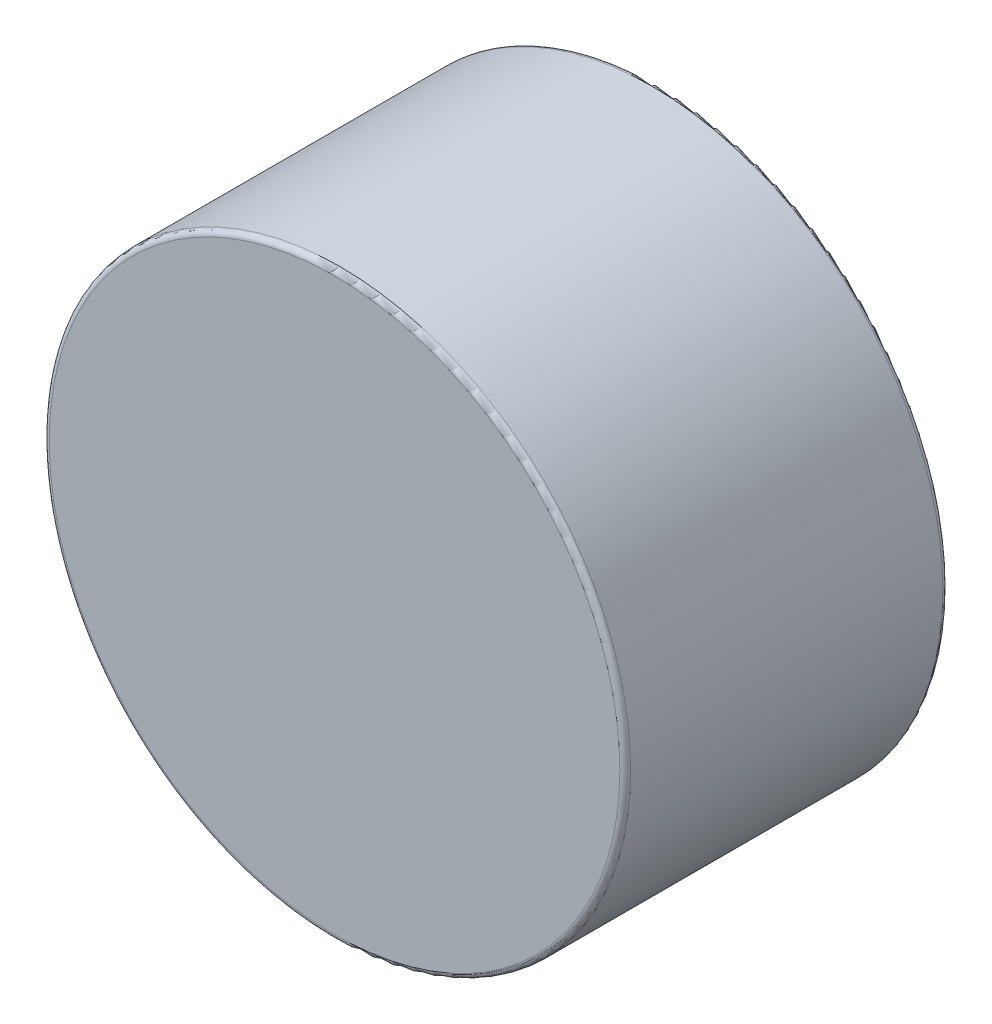
ISO-10303-21;
HEADER;
FILE_DESCRIPTION(('STEP AP214'),'2;1');
FILE_NAME('part.step','',(''),(''),'','','');
FILE_SCHEMA(('AUTOMOTIVE_DESIGN { 1 0 10303 214 1 1 1 1 }'));
ENDSEC;
DATA;
#1=APPLICATION_CONTEXT('core data for automotive mechanical design processes');
#2=APPLICATION_PROTOCOL_DEFINITION('international standard','automotive_design',2000,#1);
#3=PRODUCT_CONTEXT('',#1,'mechanical');
#4=PRODUCT('Part','Part','',(#3));
#5=PRODUCT_RELATED_PRODUCT_CATEGORY('part','',(#4));
#6=PRODUCT_DEFINITION_FORMATION('','',#4);
#7=PRODUCT_DEFINITION_CONTEXT('part definition',#1,'design');
#8=PRODUCT_DEFINITION('design','',#6,#7);
#9=PRODUCT_DEFINITION_SHAPE('','',#8);
#10=(LENGTH_UNIT() NAMED_UNIT(*) SI_UNIT(.MILLI.,.METRE.));
#11=(NAMED_UNIT(*) PLANE_ANGLE_UNIT() SI_UNIT($,.RADIAN.));
#12=(NAMED_UNIT(*) SI_UNIT($,.STERADIAN.) SOLID_ANGLE_UNIT());
#13=UNCERTAINTY_MEASURE_WITH_UNIT(LENGTH_MEASURE(1.E-05),#10,'distance_accuracy_value','');
#14=(GEOMETRIC_REPRESENTATION_CONTEXT(3) GLOBAL_UNCERTAINTY_ASSIGNED_CONTEXT((#13)) GLOBAL_UNIT_ASSIGNED_CONTEXT((#10,
#11,#12)) REPRESENTATION_CONTEXT('',''));
#15=CARTESIAN_POINT('',(0.,0.,0.));
#16=DIRECTION('',(0.,0.,1.));
#17=DIRECTION('',(1.,0.,0.));
#18=AXIS2_PLACEMENT_3D('',#15,#16,#17);
#19=CARTESIAN_POINT('',(0.,0.,15.));
#20=DIRECTION('',(0.,0.,-1.));
#21=DIRECTION('',(-1.,0.,0.));
#22=AXIS2_PLACEMENT_3D('',#19,#20,#21);
#23=CYLINDRICAL_SURFACE('',#22,27.);
#24=CARTESIAN_POINT('',(0.,0.,-14.5));
#25=DIRECTION('',(0.,0.,1.));
#26=DIRECTION('',(1.,0.,0.));
#27=AXIS2_PLACEMENT_3D('',#24,#25,#26);
#28=CIRCLE('',#27,27.);
#29=CARTESIAN_POINT('',(27.,0.,-14.5));
#30=VERTEX_POINT('',#29);
#31=EDGE_CURVE('E46',#30,#30,#28,.T.);
#32=ORIENTED_EDGE('',*,*,#31,.T.);
#33=EDGE_LOOP('',(#32));
#34=FACE_BOUND('',#33,.T.);
#35=CARTESIAN_POINT('',(0.,0.,14.5));
#36=DIRECTION('',(0.,0.,1.));
#37=DIRECTION('',(1.,0.,0.));
#38=AXIS2_PLACEMENT_3D('',#35,#36,#37);
#39=CIRCLE('',#38,27.);
#40=CARTESIAN_POINT('',(27.,0.,14.5));
#41=VERTEX_POINT('',#40);
#42=EDGE_CURVE('E50',#41,#41,#39,.F.);
#43=ORIENTED_EDGE('',*,*,#42,.T.);
#44=EDGE_LOOP('',(#43));
#45=FACE_BOUND('',#44,.T.);
#46=ADVANCED_FACE('F35',(#34,#45),#23,.T.);
#47=CARTESIAN_POINT('',(0.,0.,15.));
#48=DIRECTION('',(0.,0.,1.));
#49=DIRECTION('',(1.,0.,0.));
#50=AXIS2_PLACEMENT_3D('',#47,#48,#49);
#51=PLANE('',#50);
#52=CARTESIAN_POINT('',(0.,0.,15.));
#53=DIRECTION('',(0.,0.,1.));
#54=DIRECTION('',(1.,0.,0.));
#55=AXIS2_PLACEMENT_3D('',#52,#53,#54);
#56=CIRCLE('',#55,26.5);
#57=CARTESIAN_POINT('',(26.5,0.,15.));
#58=VERTEX_POINT('',#57);
#59=EDGE_CURVE('E10',#58,#58,#56,.T.);
#60=ORIENTED_EDGE('',*,*,#59,.T.);
#61=EDGE_LOOP('',(#60));
#62=FACE_BOUND('',#61,.T.);
#63=ADVANCED_FACE('F66',(#62),#51,.T.);
#64=CARTESIAN_POINT('',(0.,0.,-15.));
#65=DIRECTION('',(0.,0.,1.));
#66=DIRECTION('',(1.,0.,0.));
#67=AXIS2_PLACEMENT_3D('',#64,#65,#66);
#68=PLANE('',#67);
#69=CARTESIAN_POINT('',(0.,0.,-15.));
#70=DIRECTION('',(0.,0.,1.));
#71=DIRECTION('',(1.,0.,0.));
#72=AXIS2_PLACEMENT_3D('',#69,#70,#71);
#73=CIRCLE('',#72,26.5);
#74=CARTESIAN_POINT('',(26.5,0.,-15.));
#75=VERTEX_POINT('',#74);
#76=EDGE_CURVE('E42',#75,#75,#73,.F.);
#77=ORIENTED_EDGE('',*,*,#76,.T.);
#78=EDGE_LOOP('',(#77));
#79=FACE_BOUND('',#78,.T.);
#80=ADVANCED_FACE('F63',(#79),#68,.F.);
#81=CARTESIAN_POINT('',(0.,0.,-14.5));
#82=DIRECTION('',(0.,0.,1.));
#83=DIRECTION('',(1.,0.,0.));
#84=AXIS2_PLACEMENT_3D('',#81,#82,#83);
#85=TOROIDAL_SURFACE('',#84,26.5,0.5);
#86=ORIENTED_EDGE('',*,*,#76,.F.);
#87=EDGE_LOOP('',(#86));
#88=FACE_BOUND('',#87,.T.);
#89=ORIENTED_EDGE('',*,*,#31,.F.);
#90=EDGE_LOOP('',(#89));
#91=FACE_BOUND('',#90,.T.);
#92=ADVANCED_FACE('F59',(#88,#91),#85,.T.);
#93=CARTESIAN_POINT('',(0.,0.,14.5));
#94=DIRECTION('',(0.,0.,1.));
#95=DIRECTION('',(1.,0.,0.));
#96=AXIS2_PLACEMENT_3D('',#93,#94,#95);
#97=TOROIDAL_SURFACE('',#96,26.5,0.5);
#98=ORIENTED_EDGE('',*,*,#42,.F.);
#99=EDGE_LOOP('',(#98));
#100=FACE_BOUND('',#99,.T.);
#101=ORIENTED_EDGE('',*,*,#59,.F.);
#102=EDGE_LOOP('',(#101));
#103=FACE_BOUND('',#102,.T.);
#104=ADVANCED_FACE('F37',(#100,#103),#97,.T.);
#105=CLOSED_SHELL('',(#46,#63,#80,#92,#104));
#106=MANIFOLD_SOLID_BREP('B2',#105);
#107=ADVANCED_BREP_SHAPE_REPRESENTATION('',(#18,#106),#14);
#108=SHAPE_DEFINITION_REPRESENTATION(#9,#107);
ENDSEC;
END-ISO-10303-21;
